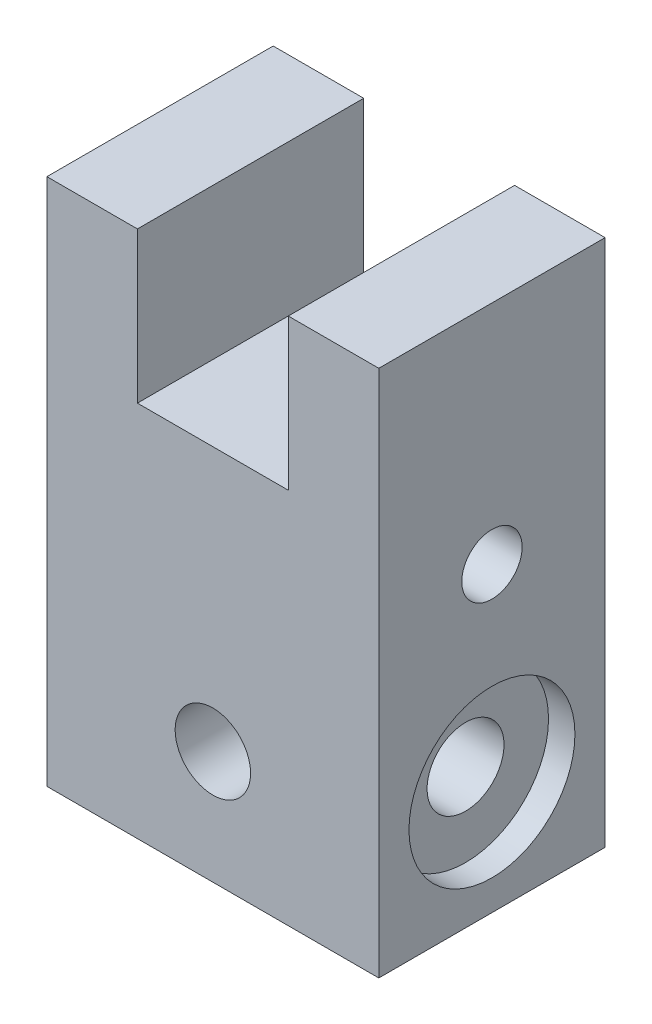
ISO-10303-21;
HEADER;
FILE_DESCRIPTION(('STEP AP214'),'2;1');
FILE_NAME('part.step','',(''),(''),'','','');
FILE_SCHEMA(('AUTOMOTIVE_DESIGN { 1 0 10303 214 1 1 1 1 }'));
ENDSEC;
DATA;
#1=APPLICATION_CONTEXT('core data for automotive mechanical design processes');
#2=APPLICATION_PROTOCOL_DEFINITION('international standard','automotive_design',2000,#1);
#3=PRODUCT_CONTEXT('',#1,'mechanical');
#4=PRODUCT('Part','Part','',(#3));
#5=PRODUCT_RELATED_PRODUCT_CATEGORY('part','',(#4));
#6=PRODUCT_DEFINITION_FORMATION('','',#4);
#7=PRODUCT_DEFINITION_CONTEXT('part definition',#1,'design');
#8=PRODUCT_DEFINITION('design','',#6,#7);
#9=PRODUCT_DEFINITION_SHAPE('','',#8);
#10=(LENGTH_UNIT() NAMED_UNIT(*) SI_UNIT(.MILLI.,.METRE.));
#11=(NAMED_UNIT(*) PLANE_ANGLE_UNIT() SI_UNIT($,.RADIAN.));
#12=(NAMED_UNIT(*) SI_UNIT($,.STERADIAN.) SOLID_ANGLE_UNIT());
#13=UNCERTAINTY_MEASURE_WITH_UNIT(LENGTH_MEASURE(1.E-05),#10,'distance_accuracy_value','');
#14=(GEOMETRIC_REPRESENTATION_CONTEXT(3) GLOBAL_UNCERTAINTY_ASSIGNED_CONTEXT((#13)) GLOBAL_UNIT_ASSIGNED_CONTEXT((#10,
#11,#12)) REPRESENTATION_CONTEXT('',''));
#15=CARTESIAN_POINT('',(0.,0.,0.));
#16=DIRECTION('',(0.,0.,1.));
#17=DIRECTION('',(1.,0.,0.));
#18=AXIS2_PLACEMENT_3D('',#15,#16,#17);
#19=CARTESIAN_POINT('',(0.,-20.,30.));
#20=DIRECTION('',(0.,0.,-1.));
#21=DIRECTION('',(-1.,0.,0.));
#22=AXIS2_PLACEMENT_3D('',#19,#20,#21);
#23=CYLINDRICAL_SURFACE('',#22,4.99999999999999);
#24=CARTESIAN_POINT('',(-4.99999999999999,-20.,20.1));
#25=CARTESIAN_POINT('',(-4.99999938883946,-20.1123940697062,20.0999993905356));
#26=CARTESIAN_POINT('',(-4.99620273409828,-20.2247969901896,20.096277023235));
#27=CARTESIAN_POINT('',(-4.98109753685119,-20.4486117298508,20.0814693234126));
#28=CARTESIAN_POINT('',(-4.96978818330873,-20.5600234407061,20.0703831959331));
#29=CARTESIAN_POINT('',(-4.93989274839192,-20.7809552507566,20.0410843618527));
#30=CARTESIAN_POINT('',(-4.92130380175463,-20.8904745873651,20.0228688491126));
#31=CARTESIAN_POINT('',(-4.87721207133648,-21.1067952217024,19.979676492711));
#32=CARTESIAN_POINT('',(-4.85170611820114,-21.2135952488514,19.9546965496127));
#33=CARTESIAN_POINT('',(-4.79445298905873,-21.4229963149376,19.8986473254707));
#34=CARTESIAN_POINT('',(-4.76275122719556,-21.525621707947,19.8676223581193));
#35=CARTESIAN_POINT('',(-4.69349933438181,-21.7269657735753,19.7998837672135));
#36=CARTESIAN_POINT('',(-4.65594701278198,-21.8256829653957,19.763168012861));
#37=CARTESIAN_POINT('',(-4.53533692645986,-22.1152791120684,19.6453189604361));
#38=CARTESIAN_POINT('',(-4.44428734893339,-22.2997403074146,19.5564459465569));
#39=CARTESIAN_POINT('',(-4.20417392701182,-22.7213108193189,19.322505945113));
#40=CARTESIAN_POINT('',(-4.04661791593068,-22.9490677290808,19.1693272044591));
#41=CARTESIAN_POINT('',(-3.79183142873294,-23.2619355683763,18.9226950310225));
#42=CARTESIAN_POINT('',(-3.70365902606225,-23.361577191205,18.8375120053331));
#43=CARTESIAN_POINT('',(-3.52196435648985,-23.5514805066895,18.6624635457724));
#44=CARTESIAN_POINT('',(-3.42844219090556,-23.6417423768945,18.5725982005809));
#45=CARTESIAN_POINT('',(-3.20102549888611,-23.8450776978563,18.3548638020938));
#46=CARTESIAN_POINT('',(-3.06509252427805,-23.9540885044516,18.225330930573));
#47=CARTESIAN_POINT('',(-2.7858950196035,-24.1555320041199,17.9612719504092));
#48=CARTESIAN_POINT('',(-2.64262651147801,-24.247955576889,17.8267431435693));
#49=CARTESIAN_POINT('',(-2.34977259493208,-24.4166823975563,17.5550826453986));
#50=CARTESIAN_POINT('',(-2.20019749447537,-24.4930108137673,17.4179553888693));
#51=CARTESIAN_POINT('',(-1.89449621717813,-24.6302278283802,17.1434607087125));
#52=CARTESIAN_POINT('',(-1.7383744748575,-24.6911266875649,17.0060935061829));
#53=CARTESIAN_POINT('',(-1.47348472846964,-24.7792197276087,16.7827143448104));
#54=CARTESIAN_POINT('',(-1.3671696822727,-24.8107644817282,16.6954845942701));
#55=CARTESIAN_POINT('',(-1.14930451610944,-24.8674253133798,16.5251740585487));
#56=CARTESIAN_POINT('',(-1.03774971650812,-24.8925355098598,16.4420971243716));
#57=CARTESIAN_POINT('',(-0.837235231619031,-24.9301628542857,16.3065470074317));
#58=CARTESIAN_POINT('',(-0.750126875584518,-24.944253696249,16.2517997832231));
#59=CARTESIAN_POINT('',(-0.569550437915913,-24.9682864399453,16.152685260939));
#60=CARTESIAN_POINT('',(-0.476104062839283,-24.978241745637,16.1082846365546));
#61=CARTESIAN_POINT('',(-0.321076492559271,-24.9900135723507,16.0536713300062));
#62=CARTESIAN_POINT('',(-0.262027114375922,-24.9934935071223,16.0369000410613));
#63=CARTESIAN_POINT('',(-0.141977093931662,-24.998342197072,16.0132753699319));
#64=CARTESIAN_POINT('',(-0.0809837632249051,-24.9997180852815,16.0063884830536));
#65=CARTESIAN_POINT('',(0.0415519827330485,-25.0002041737693,16.0039733849535));
#66=CARTESIAN_POINT('',(0.103095624630971,-24.9993032668446,16.0085008577131));
#67=CARTESIAN_POINT('',(0.224491766708706,-24.9953296237986,16.0279944983225));
#68=CARTESIAN_POINT('',(0.284339108966336,-24.9922508772992,16.0429895529805));
#69=CARTESIAN_POINT('',(0.438476094120602,-24.9816626149627,16.0926998390741));
#70=CARTESIAN_POINT('',(0.530474672282725,-24.9725806145029,16.1338914815036));
#71=CARTESIAN_POINT('',(0.708353745057084,-24.950387928059,16.2271878426125));
#72=CARTESIAN_POINT('',(0.79419851413191,-24.937255749126,16.2793502984208));
#73=CARTESIAN_POINT('',(0.954171628588626,-24.9087211796285,16.3846240945548));
#74=CARTESIAN_POINT('',(1.02867037475391,-24.8936145122802,16.4372606655345));
#75=CARTESIAN_POINT('',(1.17496141265023,-24.860564435316,16.5453544739763));
#76=CARTESIAN_POINT('',(1.24675232806403,-24.8426196065753,16.6008131130568));
#77=CARTESIAN_POINT('',(1.45931524834285,-24.7845643487627,16.7697704229221));
#78=CARTESIAN_POINT('',(1.5970377550248,-24.7402772884243,16.8856805589752));
#79=CARTESIAN_POINT('',(1.86712145824969,-24.6405329512191,17.1193662105984));
#80=CARTESIAN_POINT('',(1.99947253956822,-24.5850556764047,17.2371447129109));
#81=CARTESIAN_POINT('',(2.25921821236794,-24.462792305436,17.4720427882356));
#82=CARTESIAN_POINT('',(2.38661740669005,-24.396017035781,17.5891628821945));
#83=CARTESIAN_POINT('',(2.63636439200517,-24.2509277412028,17.8210446969145));
#84=CARTESIAN_POINT('',(2.75872188652085,-24.1726373478705,17.9358107118061));
#85=CARTESIAN_POINT('',(2.99825995240174,-24.0039854348032,18.161962644206));
#86=CARTESIAN_POINT('',(3.115438738311,-23.9136197944455,18.2733473918789));
#87=CARTESIAN_POINT('',(3.34353766187315,-23.7206204437742,18.4911463889659));
#88=CARTESIAN_POINT('',(3.45447156547252,-23.618015407946,18.597571474232));
#89=CARTESIAN_POINT('',(3.66920843635936,-23.4000458080326,18.8042402475719));
#90=CARTESIAN_POINT('',(3.77301445570251,-23.2846867609567,18.9044865793911));
#91=CARTESIAN_POINT('',(4.01531700878147,-22.9879941992651,19.1390193004885));
#92=CARTESIAN_POINT('',(4.14939291064509,-22.7997094791452,19.2692698930109));
#93=CARTESIAN_POINT('',(4.39467267725079,-22.3963412728561,19.5080336083476));
#94=CARTESIAN_POINT('',(4.50590079119612,-22.1812865921795,19.6165697742674));
#95=CARTESIAN_POINT('',(4.68284937407106,-21.7644212614809,19.7894451797793));
#96=CARTESIAN_POINT('',(4.75306495770468,-21.5663782416278,19.8581358486135));
#97=CARTESIAN_POINT('',(4.83999623805848,-21.2592881282573,19.9432306811152));
#98=CARTESIAN_POINT('',(4.86591198497462,-21.1552276997866,19.9686093582196));
#99=CARTESIAN_POINT('',(4.91118850676015,-20.9443689261955,20.0129583556086));
#100=CARTESIAN_POINT('',(4.93055207073866,-20.8375717669152,20.0319314026105));
#101=CARTESIAN_POINT('',(4.96245390011843,-20.6213433458562,20.0631945074366));
#102=CARTESIAN_POINT('',(4.97495160640553,-20.5119003356409,20.0754448513639));
#103=CARTESIAN_POINT('',(4.99269062328222,-20.2919083389087,20.0928338436306));
#104=CARTESIAN_POINT('',(4.9979350187314,-20.1813598427209,20.097975515314));
#105=CARTESIAN_POINT('',(5.0010650581874,-19.9600525404489,20.1010441698409));
#106=CARTESIAN_POINT('',(4.99895031247216,-19.849293723537,20.0989707705919));
#107=CARTESIAN_POINT('',(4.98740715914405,-19.6285334611735,20.087654556321));
#108=CARTESIAN_POINT('',(4.97797910299165,-19.5185319795823,20.0784120858277));
#109=CARTESIAN_POINT('',(4.95313657018676,-19.3097029676978,20.0540633503142));
#110=CARTESIAN_POINT('',(4.93831468605928,-19.2107363365119,20.0395375962731));
#111=CARTESIAN_POINT('',(4.90299114589694,-19.0148061314699,20.0049285656618));
#112=CARTESIAN_POINT('',(4.88248781162426,-18.9178431585805,19.9848436469776));
#113=CARTESIAN_POINT('',(4.81289199003775,-18.6307919206377,19.9166898394164));
#114=CARTESIAN_POINT('',(4.75569857833229,-18.4444186113975,19.8607070751489));
#115=CARTESIAN_POINT('',(4.64574506258124,-18.1471934532557,19.7531952644125));
#116=CARTESIAN_POINT('',(4.59822973735862,-18.0324196067918,19.7067606685834));
#117=CARTESIAN_POINT('',(4.49611957002097,-17.8091178569083,19.6070564503149));
#118=CARTESIAN_POINT('',(4.44152288740802,-17.7005915879059,19.5537850509769));
#119=CARTESIAN_POINT('',(4.2682854183295,-17.3847688708593,19.3849282639809));
#120=CARTESIAN_POINT('',(4.14025118008304,-17.1873698531876,19.2603531562302));
#121=CARTESIAN_POINT('',(3.81616986427527,-16.7544016988713,18.9460137910313));
#122=CARTESIAN_POINT('',(3.61213715774935,-16.5302633069813,18.748830747909));
#123=CARTESIAN_POINT('',(3.28788033526121,-16.2301717520683,18.4379113884683));
#124=CARTESIAN_POINT('',(3.17658438451818,-16.1360497660751,18.3315812447131));
#125=CARTESIAN_POINT('',(2.94866328717599,-15.9594362722775,18.1150193359204));
#126=CARTESIAN_POINT('',(2.83203918171972,-15.8769425050342,18.0047883340671));
#127=CARTESIAN_POINT('',(2.59026962582338,-15.7207608620611,17.7780682371806));
#128=CARTESIAN_POINT('',(2.46497089280561,-15.6474395505771,17.6614917768472));
#129=CARTESIAN_POINT('',(2.20953638916673,-15.5123691803153,17.4268299826125));
#130=CARTESIAN_POINT('',(2.07939842549348,-15.4506254468001,17.3087439809214));
#131=CARTESIAN_POINT('',(1.81432466377661,-15.3385700061652,17.0731597073836));
#132=CARTESIAN_POINT('',(1.6794004534695,-15.2882326125725,16.9556607096287));
#133=CARTESIAN_POINT('',(1.47217645545821,-15.2210938418232,16.7821105415002));
#134=CARTESIAN_POINT('',(1.40232215954265,-15.2001150005986,16.7247308697154));
#135=CARTESIAN_POINT('',(1.26056558325097,-15.1609520251802,16.611580138564));
#136=CARTESIAN_POINT('',(1.18866375360582,-15.1427672814632,16.5558087305227));
#137=CARTESIAN_POINT('',(1.0308945320721,-15.1066584063721,16.438581882256));
#138=CARTESIAN_POINT('',(0.944582629335364,-15.0892063675016,16.3775751267407));
#139=CARTESIAN_POINT('',(0.766754131203087,-15.058315443,16.2622494075815));
#140=CARTESIAN_POINT('',(0.675240392162123,-15.0448743797859,16.207926824509));
#141=CARTESIAN_POINT('',(0.517407414570502,-15.0264455046954,16.1290735515903));
#142=CARTESIAN_POINT('',(0.453210107545415,-15.0201394970412,16.1007146725092));
#143=CARTESIAN_POINT('',(0.321299583514299,-15.009898872766,16.0533199277481));
#144=CARTESIAN_POINT('',(0.253598092567582,-15.0059568405411,16.0342549434418));
#145=CARTESIAN_POINT('',(0.127575882896808,-15.0013030905297,16.0115082104024));
#146=CARTESIAN_POINT('',(0.0696679466529424,-15.0001492635833,16.0057298927046));
#147=CARTESIAN_POINT('',(-0.0462215085406665,-14.9998782230557,16.0043819775927));
#148=CARTESIAN_POINT('',(-0.104202900730942,-15.0007590252266,16.008802433941));
#149=CARTESIAN_POINT('',(-0.23430981026927,-15.004959620603,16.0294180510585));
#150=CARTESIAN_POINT('',(-0.305934928922705,-15.0088840967342,16.0485196883654));
#151=CARTESIAN_POINT('',(-0.445437451004786,-15.0193838549233,16.0973041252139));
#152=CARTESIAN_POINT('',(-0.513292103096337,-15.0259735817387,16.1270444798487));
#153=CARTESIAN_POINT('',(-0.677722921199077,-15.0451515193746,16.2091269188347));
#154=CARTESIAN_POINT('',(-0.772110096247877,-15.0590971476556,16.2654082682225));
#155=CARTESIAN_POINT('',(-0.955597315168207,-15.0912821974565,16.3850583393978));
#156=CARTESIAN_POINT('',(-1.04468280791503,-15.1095328101592,16.4484453035834));
#157=CARTESIAN_POINT('',(-1.2196473490044,-15.1501997871947,16.5792916602226));
#158=CARTESIAN_POINT('',(-1.30550445082032,-15.1726400268042,16.6467728168068));
#159=CARTESIAN_POINT('',(-1.47434395789639,-15.2215053577082,16.7836144950955));
#160=CARTESIAN_POINT('',(-1.55732943230454,-15.2479260221852,16.8529728596379));
#161=CARTESIAN_POINT('',(-1.80939407509645,-15.3353881051664,17.0678113281786));
#162=CARTESIAN_POINT('',(-1.97492452222866,-15.4030665235455,17.2148124017508));
#163=CARTESIAN_POINT('',(-2.29871780234092,-15.5561380944276,17.5079007076153));
#164=CARTESIAN_POINT('',(-2.45697329283375,-15.6415486841882,17.6539868934585));
#165=CARTESIAN_POINT('',(-2.76528790163346,-15.8303806906747,17.9417268223543));
#166=CARTESIAN_POINT('',(-2.9153774387456,-15.9337282510637,18.0833960356533));
#167=CARTESIAN_POINT('',(-3.20677925659712,-16.159363538154,18.3602677157739));
#168=CARTESIAN_POINT('',(-3.34809869104244,-16.2816355361104,18.4954754319242));
#169=CARTESIAN_POINT('',(-3.65577428699677,-16.5805626717426,18.791096914425));
#170=CARTESIAN_POINT('',(-3.8190529655827,-16.7630853680067,18.9488927101653));
#171=CARTESIAN_POINT('',(-4.12321763802115,-17.1607038166318,19.243766339593));
#172=CARTESIAN_POINT('',(-4.2641277829106,-17.3757639417594,19.3808665101372));
#173=CARTESIAN_POINT('',(-4.49176480766176,-17.7934007719016,19.6027643812051));
#174=CARTESIAN_POINT('',(-4.58370036445148,-17.9904111787305,19.6925498887749));
#175=CARTESIAN_POINT('',(-4.70325565682088,-18.2995228356619,19.8094224851455));
#176=CARTESIAN_POINT('',(-4.74004601807609,-18.4048122826964,19.8454090761987));
#177=CARTESIAN_POINT('',(-4.80695094370819,-18.6194778829025,19.9108786905929));
#178=CARTESIAN_POINT('',(-4.83706665514042,-18.7288533301037,19.940362831392));
#179=CARTESIAN_POINT('',(-4.88582600582943,-18.933265790087,19.9881134317611));
#180=CARTESIAN_POINT('',(-4.90553314999992,-19.0278087777144,20.0074188921567));
#181=CARTESIAN_POINT('',(-4.93954358341147,-19.2187762358926,20.0407419289476));
#182=CARTESIAN_POINT('',(-4.95384763626243,-19.3152004385471,20.0547602525646));
#183=CARTESIAN_POINT('',(-4.97682979090269,-19.509365242297,20.0772856495319));
#184=CARTESIAN_POINT('',(-4.98550749698689,-19.6071059354887,20.0857923352446));
#185=CARTESIAN_POINT('',(-4.99709211644436,-19.8032289410168,20.0971490395287));
#186=CARTESIAN_POINT('',(-5.0000005350053,-19.9016110792802,20.1000005335206));
#187=CARTESIAN_POINT('',(-4.99999999999999,-20.,20.1));
#188=B_SPLINE_CURVE_WITH_KNOTS('',3,(#24,#25,#26,#27,#28,#29,#30,#31,#32,#33,#34,#35,#36,#37,
#38,#39,#40,#41,#42,#43,#44,#45,#46,#47,#48,#49,#50,#51,#52,#53,#54,#55,#56,#57,#58,#59,#60,#61,
#62,#63,#64,#65,#66,#67,#68,#69,#70,#71,#72,#73,#74,#75,#76,#77,#78,#79,#80,#81,#82,#83,#84,#85,
#86,#87,#88,#89,#90,#91,#92,#93,#94,#95,#96,#97,#98,#99,#100,#101,#102,#103,#104,#105,#106,#107,
#108,#109,#110,#111,#112,#113,#114,#115,#116,#117,#118,#119,#120,#121,#122,#123,#124,#125,#126,
#127,#128,#129,#130,#131,#132,#133,#134,#135,#136,#137,#138,#139,#140,#141,#142,#143,#144,#145,
#146,#147,#148,#149,#150,#151,#152,#153,#154,#155,#156,#157,#158,#159,#160,#161,#162,#163,#164,
#165,#166,#167,#168,#169,#170,#171,#172,#173,#174,#175,#176,#177,#178,#179,#180,#181,#182,#183,
#184,#185,#186,#187),.UNSPECIFIED.,.T.,.F.,(4,2,2,2,2,2,2,2,2,2,2,2,2,2,2,2,2,2,2,2,2,2,2,2,2,2,
2,2,2,2,2,2,2,2,2,2,2,2,2,2,2,2,2,2,2,2,2,2,2,2,2,2,2,2,2,2,2,2,2,2,2,2,2,2,2,2,2,2,2,2,2,2,2,2,
2,2,2,2,2,2,2,4),(0.,0.337073234581563,0.674182863960078,1.01142531396549,1.34882254943247,
1.68383368191582,2.01897055681925,2.68880549574337,3.63279806025707,4.10643159594765,
4.58005616461381,5.23048430359105,5.8812689847548,6.53102834828947,7.18035447559783,
7.60344963531998,8.02693012696502,8.33812920367037,8.64831161090039,8.83209802624871,
9.01525998607135,9.1993172131728,9.3838843912326,9.68578472243752,9.98931553650319,
10.2665180337727,10.5438595773719,11.0994309508408,11.6560041212273,12.2120469355288,
12.7669641496501,13.3220712126332,13.8759024094902,14.4294949657695,15.2225837474366,
16.0148263952475,16.6750119629206,17.0052629904454,17.3353732605574,17.6674131987194,
17.9993118756116,18.3312281293111,18.663128432886,18.966135439385,19.2692320464061,
19.8750558067868,20.2724450148882,20.6699377151733,21.4653975763528,22.5440547076217,
23.0849637376934,23.6257675202904,24.1838886213989,24.7422658114395,25.2993727847416,
25.5777210565778,25.8560085211854,26.1771849466211,26.4981866848757,26.7091092131385,
26.9193665852082,27.0931088819884,27.2666818102157,27.4880380127104,27.7106103195533,
28.0420697744171,28.3744005723748,28.7086864562485,29.0426032726942,29.7362002845327,
30.4304826161462,31.1219712391351,31.8128881984081,32.6839251407553,33.5540151428795,
34.2566123890258,34.6078246660004,34.9589765393823,35.2541458965284,35.5492735222592,
35.8444219022812,36.1394932689529),.UNSPECIFIED.);
#189=CARTESIAN_POINT('',(-4.99999999999999,-20.,20.1));
#190=VERTEX_POINT('',#189);
#191=EDGE_CURVE('E46',#190,#190,#188,.T.);
#192=ORIENTED_EDGE('',*,*,#191,.F.);
#193=EDGE_LOOP('',(#192));
#194=FACE_BOUND('',#193,.T.);
#195=CARTESIAN_POINT('',(0.,-20.,30.));
#196=DIRECTION('',(0.,0.,1.));
#197=DIRECTION('',(1.,0.,0.));
#198=AXIS2_PLACEMENT_3D('',#195,#196,#197);
#199=CIRCLE('',#198,4.99999999999999);
#200=CARTESIAN_POINT('',(5.,-20.,30.));
#201=VERTEX_POINT('',#200);
#202=EDGE_CURVE('E262',#201,#201,#199,.T.);
#203=ORIENTED_EDGE('',*,*,#202,.T.);
#204=EDGE_LOOP('',(#203));
#205=FACE_BOUND('',#204,.T.);
#206=ADVANCED_FACE('F41',(#194,#205),#23,.F.);
#207=CARTESIAN_POINT('',(10.,0.,30.));
#208=DIRECTION('',(-1.,0.,0.));
#209=DIRECTION('',(0.,-1.,0.));
#210=AXIS2_PLACEMENT_3D('',#207,#208,#209);
#211=PLANE('',#210);
#212=DIRECTION('',(0.,1.,0.));
#213=VECTOR('',#212,1.);
#214=CARTESIAN_POINT('',(10.,0.,0.));
#215=LINE('',#214,#213);
#216=CARTESIAN_POINT('',(10.,15.,0.));
#217=VERTEX_POINT('',#216);
#218=CARTESIAN_POINT('',(10.,35.,0.));
#219=VERTEX_POINT('',#218);
#220=EDGE_CURVE('E152',#217,#219,#215,.T.);
#221=ORIENTED_EDGE('',*,*,#220,.F.);
#222=DIRECTION('',(0.,0.,-1.));
#223=VECTOR('',#222,1.);
#224=CARTESIAN_POINT('',(10.,15.,30.));
#225=LINE('',#224,#223);
#226=CARTESIAN_POINT('',(10.,15.,30.));
#227=VERTEX_POINT('',#226);
#228=EDGE_CURVE('E11',#227,#217,#225,.T.);
#229=ORIENTED_EDGE('',*,*,#228,.F.);
#230=DIRECTION('',(0.,1.,0.));
#231=VECTOR('',#230,1.);
#232=CARTESIAN_POINT('',(10.,0.,30.));
#233=LINE('',#232,#231);
#234=CARTESIAN_POINT('',(10.,35.,30.));
#235=VERTEX_POINT('',#234);
#236=EDGE_CURVE('E257',#227,#235,#233,.T.);
#237=ORIENTED_EDGE('',*,*,#236,.T.);
#238=DIRECTION('',(0.,0.,-1.));
#239=VECTOR('',#238,1.);
#240=CARTESIAN_POINT('',(10.,35.,30.));
#241=LINE('',#240,#239);
#242=EDGE_CURVE('E66',#235,#219,#241,.T.);
#243=ORIENTED_EDGE('',*,*,#242,.T.);
#244=EDGE_LOOP('',(#221,#229,#237,#243));
#245=FACE_BOUND('',#244,.T.);
#246=ADVANCED_FACE('F240',(#245),#211,.T.);
#247=CARTESIAN_POINT('',(0.,15.,30.));
#248=DIRECTION('',(0.,1.,0.));
#249=DIRECTION('',(0.,0.,1.));
#250=AXIS2_PLACEMENT_3D('',#247,#248,#249);
#251=PLANE('',#250);
#252=DIRECTION('',(1.,0.,0.));
#253=VECTOR('',#252,1.);
#254=CARTESIAN_POINT('',(0.,15.,0.));
#255=LINE('',#254,#253);
#256=CARTESIAN_POINT('',(-9.99999999999999,15.,0.));
#257=VERTEX_POINT('',#256);
#258=EDGE_CURVE('E156',#257,#217,#255,.T.);
#259=ORIENTED_EDGE('',*,*,#258,.F.);
#260=DIRECTION('',(0.,0.,-1.));
#261=VECTOR('',#260,1.);
#262=CARTESIAN_POINT('',(-9.99999999999999,15.,30.));
#263=LINE('',#262,#261);
#264=CARTESIAN_POINT('',(-9.99999999999999,15.,30.));
#265=VERTEX_POINT('',#264);
#266=EDGE_CURVE('E57',#265,#257,#263,.T.);
#267=ORIENTED_EDGE('',*,*,#266,.F.);
#268=DIRECTION('',(1.,0.,0.));
#269=VECTOR('',#268,1.);
#270=CARTESIAN_POINT('',(0.,15.,30.));
#271=LINE('',#270,#269);
#272=EDGE_CURVE('E254',#265,#227,#271,.T.);
#273=ORIENTED_EDGE('',*,*,#272,.T.);
#274=ORIENTED_EDGE('',*,*,#228,.T.);
#275=EDGE_LOOP('',(#259,#267,#273,#274));
#276=FACE_BOUND('',#275,.T.);
#277=ADVANCED_FACE('F237',(#276),#251,.T.);
#278=CARTESIAN_POINT('',(-9.99999999999999,0.,30.));
#279=DIRECTION('',(-1.,0.,0.));
#280=DIRECTION('',(0.,0.,1.));
#281=AXIS2_PLACEMENT_3D('',#278,#279,#280);
#282=PLANE('',#281);
#283=DIRECTION('',(0.,1.,0.));
#284=VECTOR('',#283,1.);
#285=CARTESIAN_POINT('',(-9.99999999999999,0.,0.));
#286=LINE('',#285,#284);
#287=CARTESIAN_POINT('',(-9.99999999999999,35.,0.));
#288=VERTEX_POINT('',#287);
#289=EDGE_CURVE('E160',#257,#288,#286,.T.);
#290=ORIENTED_EDGE('',*,*,#289,.T.);
#291=DIRECTION('',(0.,0.,-1.));
#292=VECTOR('',#291,1.);
#293=CARTESIAN_POINT('',(-9.99999999999999,35.,30.));
#294=LINE('',#293,#292);
#295=CARTESIAN_POINT('',(-9.99999999999999,35.,30.));
#296=VERTEX_POINT('',#295);
#297=EDGE_CURVE('E187',#296,#288,#294,.T.);
#298=ORIENTED_EDGE('',*,*,#297,.F.);
#299=DIRECTION('',(0.,1.,0.));
#300=VECTOR('',#299,1.);
#301=CARTESIAN_POINT('',(-9.99999999999999,0.,30.));
#302=LINE('',#301,#300);
#303=EDGE_CURVE('E256',#265,#296,#302,.T.);
#304=ORIENTED_EDGE('',*,*,#303,.F.);
#305=ORIENTED_EDGE('',*,*,#266,.T.);
#306=EDGE_LOOP('',(#290,#298,#304,#305));
#307=FACE_BOUND('',#306,.T.);
#308=ADVANCED_FACE('F234',(#307),#282,.F.);
#309=CARTESIAN_POINT('',(0.,35.,30.));
#310=DIRECTION('',(0.,1.,0.));
#311=DIRECTION('',(0.,0.,1.));
#312=AXIS2_PLACEMENT_3D('',#309,#310,#311);
#313=PLANE('',#312);
#314=DIRECTION('',(1.,0.,0.));
#315=VECTOR('',#314,1.);
#316=CARTESIAN_POINT('',(0.,35.,0.));
#317=LINE('',#316,#315);
#318=CARTESIAN_POINT('',(-22.,35.,0.));
#319=VERTEX_POINT('',#318);
#320=EDGE_CURVE('E164',#319,#288,#317,.T.);
#321=ORIENTED_EDGE('',*,*,#320,.F.);
#322=DIRECTION('',(0.,0.,-1.));
#323=VECTOR('',#322,1.);
#324=CARTESIAN_POINT('',(-22.,35.,30.));
#325=LINE('',#324,#323);
#326=CARTESIAN_POINT('',(-22.,35.,30.));
#327=VERTEX_POINT('',#326);
#328=EDGE_CURVE('E184',#327,#319,#325,.T.);
#329=ORIENTED_EDGE('',*,*,#328,.F.);
#330=DIRECTION('',(1.,0.,0.));
#331=VECTOR('',#330,1.);
#332=CARTESIAN_POINT('',(0.,35.,30.));
#333=LINE('',#332,#331);
#334=EDGE_CURVE('E145',#327,#296,#333,.T.);
#335=ORIENTED_EDGE('',*,*,#334,.T.);
#336=ORIENTED_EDGE('',*,*,#297,.T.);
#337=EDGE_LOOP('',(#321,#329,#335,#336));
#338=FACE_BOUND('',#337,.T.);
#339=ADVANCED_FACE('F224',(#338),#313,.T.);
#340=CARTESIAN_POINT('',(-22.,0.,30.));
#341=DIRECTION('',(1.,0.,0.));
#342=DIRECTION('',(0.,1.,0.));
#343=AXIS2_PLACEMENT_3D('',#340,#341,#342);
#344=PLANE('',#343);
#345=CARTESIAN_POINT('',(-22.,4.99999999999999,15.));
#346=DIRECTION('',(1.,0.,0.));
#347=DIRECTION('',(0.,1.,0.));
#348=AXIS2_PLACEMENT_3D('',#345,#346,#347);
#349=CIRCLE('',#348,4.);
#350=CARTESIAN_POINT('',(-22.,8.99999999999999,15.));
#351=VERTEX_POINT('',#350);
#352=EDGE_CURVE('E290',#351,#351,#349,.T.);
#353=ORIENTED_EDGE('',*,*,#352,.T.);
#354=EDGE_LOOP('',(#353));
#355=FACE_BOUND('',#354,.T.);
#356=CARTESIAN_POINT('',(-22.,-20.,15.));
#357=DIRECTION('',(1.,0.,0.));
#358=DIRECTION('',(0.,1.,0.));
#359=AXIS2_PLACEMENT_3D('',#356,#357,#358);
#360=CIRCLE('',#359,5.1);
#361=CARTESIAN_POINT('',(-22.,-14.9,15.));
#362=VERTEX_POINT('',#361);
#363=EDGE_CURVE('E197',#362,#362,#360,.T.);
#364=ORIENTED_EDGE('',*,*,#363,.T.);
#365=EDGE_LOOP('',(#364));
#366=FACE_BOUND('',#365,.T.);
#367=DIRECTION('',(0.,-1.,0.));
#368=VECTOR('',#367,1.);
#369=CARTESIAN_POINT('',(-22.,0.,0.));
#370=LINE('',#369,#368);
#371=CARTESIAN_POINT('',(-22.,-35.,0.));
#372=VERTEX_POINT('',#371);
#373=EDGE_CURVE('E168',#319,#372,#370,.T.);
#374=ORIENTED_EDGE('',*,*,#373,.T.);
#375=DIRECTION('',(0.,0.,-1.));
#376=VECTOR('',#375,1.);
#377=CARTESIAN_POINT('',(-22.,-35.,30.));
#378=LINE('',#377,#376);
#379=CARTESIAN_POINT('',(-22.,-35.,30.));
#380=VERTEX_POINT('',#379);
#381=EDGE_CURVE('E137',#380,#372,#378,.T.);
#382=ORIENTED_EDGE('',*,*,#381,.F.);
#383=DIRECTION('',(0.,-1.,0.));
#384=VECTOR('',#383,1.);
#385=CARTESIAN_POINT('',(-22.,0.,30.));
#386=LINE('',#385,#384);
#387=EDGE_CURVE('E124',#327,#380,#386,.T.);
#388=ORIENTED_EDGE('',*,*,#387,.F.);
#389=ORIENTED_EDGE('',*,*,#328,.T.);
#390=EDGE_LOOP('',(#374,#382,#388,#389));
#391=FACE_BOUND('',#390,.T.);
#392=ADVANCED_FACE('F230',(#355,#366,#391),#344,.F.);
#393=CARTESIAN_POINT('',(0.,-35.,30.));
#394=DIRECTION('',(0.,1.,0.));
#395=DIRECTION('',(0.,0.,1.));
#396=AXIS2_PLACEMENT_3D('',#393,#394,#395);
#397=PLANE('',#396);
#398=DIRECTION('',(1.,0.,0.));
#399=VECTOR('',#398,1.);
#400=CARTESIAN_POINT('',(0.,-35.,0.));
#401=LINE('',#400,#399);
#402=CARTESIAN_POINT('',(22.,-35.,0.));
#403=VERTEX_POINT('',#402);
#404=EDGE_CURVE('E133',#372,#403,#401,.T.);
#405=ORIENTED_EDGE('',*,*,#404,.T.);
#406=DIRECTION('',(0.,0.,-1.));
#407=VECTOR('',#406,1.);
#408=CARTESIAN_POINT('',(22.,-35.,30.));
#409=LINE('',#408,#407);
#410=CARTESIAN_POINT('',(22.,-35.,30.));
#411=VERTEX_POINT('',#410);
#412=EDGE_CURVE('E131',#411,#403,#409,.T.);
#413=ORIENTED_EDGE('',*,*,#412,.F.);
#414=DIRECTION('',(1.,0.,0.));
#415=VECTOR('',#414,1.);
#416=CARTESIAN_POINT('',(0.,-35.,30.));
#417=LINE('',#416,#415);
#418=EDGE_CURVE('E116',#380,#411,#417,.T.);
#419=ORIENTED_EDGE('',*,*,#418,.F.);
#420=ORIENTED_EDGE('',*,*,#381,.T.);
#421=EDGE_LOOP('',(#405,#413,#419,#420));
#422=FACE_BOUND('',#421,.T.);
#423=ADVANCED_FACE('F132',(#422),#397,.F.);
#424=CARTESIAN_POINT('',(22.,0.,30.));
#425=DIRECTION('',(1.,0.,0.));
#426=DIRECTION('',(0.,1.,0.));
#427=AXIS2_PLACEMENT_3D('',#424,#425,#426);
#428=PLANE('',#427);
#429=CARTESIAN_POINT('',(22.,5.,15.));
#430=DIRECTION('',(1.,0.,0.));
#431=DIRECTION('',(0.,1.,0.));
#432=AXIS2_PLACEMENT_3D('',#429,#430,#431);
#433=CIRCLE('',#432,4.);
#434=CARTESIAN_POINT('',(22.,9.,15.));
#435=VERTEX_POINT('',#434);
#436=EDGE_CURVE('E294',#435,#435,#433,.T.);
#437=ORIENTED_EDGE('',*,*,#436,.F.);
#438=EDGE_LOOP('',(#437));
#439=FACE_BOUND('',#438,.T.);
#440=CARTESIAN_POINT('',(22.,-20.,15.));
#441=DIRECTION('',(1.,0.,0.));
#442=DIRECTION('',(0.,1.,0.));
#443=AXIS2_PLACEMENT_3D('',#440,#441,#442);
#444=CIRCLE('',#443,11.);
#445=CARTESIAN_POINT('',(22.,-9.,15.));
#446=VERTEX_POINT('',#445);
#447=EDGE_CURVE('E279',#446,#446,#444,.T.);
#448=ORIENTED_EDGE('',*,*,#447,.F.);
#449=EDGE_LOOP('',(#448));
#450=FACE_BOUND('',#449,.T.);
#451=DIRECTION('',(0.,-1.,0.));
#452=VECTOR('',#451,1.);
#453=CARTESIAN_POINT('',(22.,0.,0.));
#454=LINE('',#453,#452);
#455=CARTESIAN_POINT('',(22.,35.,0.));
#456=VERTEX_POINT('',#455);
#457=EDGE_CURVE('E175',#456,#403,#454,.T.);
#458=ORIENTED_EDGE('',*,*,#457,.F.);
#459=DIRECTION('',(0.,0.,-1.));
#460=VECTOR('',#459,1.);
#461=CARTESIAN_POINT('',(22.,35.,30.));
#462=LINE('',#461,#460);
#463=CARTESIAN_POINT('',(22.,35.,30.));
#464=VERTEX_POINT('',#463);
#465=EDGE_CURVE('E91',#464,#456,#462,.T.);
#466=ORIENTED_EDGE('',*,*,#465,.F.);
#467=DIRECTION('',(0.,-1.,0.));
#468=VECTOR('',#467,1.);
#469=CARTESIAN_POINT('',(22.,0.,30.));
#470=LINE('',#469,#468);
#471=EDGE_CURVE('E121',#464,#411,#470,.T.);
#472=ORIENTED_EDGE('',*,*,#471,.T.);
#473=ORIENTED_EDGE('',*,*,#412,.T.);
#474=EDGE_LOOP('',(#458,#466,#472,#473));
#475=FACE_BOUND('',#474,.T.);
#476=ADVANCED_FACE('F139',(#439,#450,#475),#428,.T.);
#477=CARTESIAN_POINT('',(-4.99999999999999,-20.,9.9));
#478=CARTESIAN_POINT('',(-4.99999938883946,-19.8876059302938,9.90000060946441));
#479=CARTESIAN_POINT('',(-4.99620273409828,-19.7752030098104,9.90372297676504));
#480=CARTESIAN_POINT('',(-4.98109753685119,-19.5513882701491,9.91853067658741));
#481=CARTESIAN_POINT('',(-4.96978818330873,-19.4399765592939,9.92961680406695));
#482=CARTESIAN_POINT('',(-4.93989274839192,-19.2190447492434,9.95891563814734));
#483=CARTESIAN_POINT('',(-4.92130380175463,-19.1095254126349,9.97713115088742));
#484=CARTESIAN_POINT('',(-4.87721207133648,-18.8932047782976,10.020323507289));
#485=CARTESIAN_POINT('',(-4.85170611820114,-18.7864047511486,10.0453034503873));
#486=CARTESIAN_POINT('',(-4.79445298905873,-18.5770036850623,10.1013526745293));
#487=CARTESIAN_POINT('',(-4.76275122719556,-18.4743782920529,10.1323776418807));
#488=CARTESIAN_POINT('',(-4.69349933438181,-18.2730342264247,10.2001162327865));
#489=CARTESIAN_POINT('',(-4.65594701278198,-18.1743170346043,10.236831987139));
#490=CARTESIAN_POINT('',(-4.53533692645986,-17.8847208879316,10.3546810395639));
#491=CARTESIAN_POINT('',(-4.44428734893339,-17.7002596925854,10.4435540534431));
#492=CARTESIAN_POINT('',(-4.20417392701182,-17.2786891806811,10.677494054887));
#493=CARTESIAN_POINT('',(-4.04661791593068,-17.0509322709192,10.8306727955409));
#494=CARTESIAN_POINT('',(-3.79183142873293,-16.7380644316237,11.0773049689775));
#495=CARTESIAN_POINT('',(-3.70365902606225,-16.638422808795,11.1624879946669));
#496=CARTESIAN_POINT('',(-3.52196435648985,-16.4485194933104,11.3375364542276));
#497=CARTESIAN_POINT('',(-3.42844219090556,-16.3582576231055,11.4274017994191));
#498=CARTESIAN_POINT('',(-3.20102549888612,-16.1549223021437,11.6451361979062));
#499=CARTESIAN_POINT('',(-3.06509252427805,-16.0459114955484,11.7746690694271));
#500=CARTESIAN_POINT('',(-2.78589501960349,-15.84446799588,12.0387280495908));
#501=CARTESIAN_POINT('',(-2.642626511478,-15.752044423111,12.1732568564307));
#502=CARTESIAN_POINT('',(-2.34977259493208,-15.5833176024437,12.4449173546014));
#503=CARTESIAN_POINT('',(-2.20019749447537,-15.5069891862327,12.5820446111307));
#504=CARTESIAN_POINT('',(-1.89449621717813,-15.3697721716198,12.8565392912875));
#505=CARTESIAN_POINT('',(-1.7383744748575,-15.3088733124351,12.9939064938171));
#506=CARTESIAN_POINT('',(-1.47348472846964,-15.2207802723913,13.2172856551896));
#507=CARTESIAN_POINT('',(-1.3671696822727,-15.1892355182717,13.3045154057299));
#508=CARTESIAN_POINT('',(-1.14930451610945,-15.1325746866202,13.4748259414513));
#509=CARTESIAN_POINT('',(-1.03774971650813,-15.1074644901402,13.5579028756284));
#510=CARTESIAN_POINT('',(-0.837235231619039,-15.0698371457143,13.6934529925683));
#511=CARTESIAN_POINT('',(-0.750126875584525,-15.055746303751,13.748200216777));
#512=CARTESIAN_POINT('',(-0.569550437915918,-15.0317135600547,13.8473147390611));
#513=CARTESIAN_POINT('',(-0.476104062839287,-15.021758254363,13.8917153634455));
#514=CARTESIAN_POINT('',(-0.321076492559276,-15.0099864276493,13.9463286699938));
#515=CARTESIAN_POINT('',(-0.26202711437593,-15.0065064928777,13.9630999589387));
#516=CARTESIAN_POINT('',(-0.141977093931674,-15.001657802928,13.9867246300681));
#517=CARTESIAN_POINT('',(-0.0809837632249188,-15.0002819147185,13.9936115169464));
#518=CARTESIAN_POINT('',(0.0415519827330311,-14.9997958262307,13.9960266150465));
#519=CARTESIAN_POINT('',(0.103095624630952,-15.0006967331554,13.9914991422869));
#520=CARTESIAN_POINT('',(0.224491766708684,-15.0046703762014,13.9720055016775));
#521=CARTESIAN_POINT('',(0.284339108966311,-15.0077491227008,13.9570104470196));
#522=CARTESIAN_POINT('',(0.43847609412057,-15.0183373850373,13.9073001609259));
#523=CARTESIAN_POINT('',(0.530474672282686,-15.0274193854971,13.8661085184964));
#524=CARTESIAN_POINT('',(0.708353745057037,-15.049612071941,13.7728121573875));
#525=CARTESIAN_POINT('',(0.794198514131859,-15.0627442508739,13.7206497015792));
#526=CARTESIAN_POINT('',(0.954171628588568,-15.0912788203714,13.6153759054453));
#527=CARTESIAN_POINT('',(1.02867037475385,-15.1063854877198,13.5627393344656));
#528=CARTESIAN_POINT('',(1.17496141265016,-15.139435564684,13.4546455260238));
#529=CARTESIAN_POINT('',(1.24675232806396,-15.1573803934246,13.3991868869433));
#530=CARTESIAN_POINT('',(1.45931524834277,-15.2154356512372,13.230229577078));
#531=CARTESIAN_POINT('',(1.59703775502473,-15.2597227115757,13.1143194410249));
#532=CARTESIAN_POINT('',(1.8671214582496,-15.3594670487808,12.8806337894017));
#533=CARTESIAN_POINT('',(1.99947253956813,-15.4149443235953,12.7628552870892));
#534=CARTESIAN_POINT('',(2.25921821236784,-15.5372076945639,12.5279572117645));
#535=CARTESIAN_POINT('',(2.38661740668995,-15.6039829642189,12.4108371178056));
#536=CARTESIAN_POINT('',(2.63636439200506,-15.7490722587971,12.1789553030856));
#537=CARTESIAN_POINT('',(2.75872188652074,-15.8273626521294,12.0641892881941));
#538=CARTESIAN_POINT('',(2.99825995240163,-15.9960145651966,11.8380373557941));
#539=CARTESIAN_POINT('',(3.11543873831088,-16.0863802055544,11.7266526081212));
#540=CARTESIAN_POINT('',(3.34353766187302,-16.2793795562257,11.5088536110343));
#541=CARTESIAN_POINT('',(3.4544715654724,-16.3819845920539,11.4024285257681));
#542=CARTESIAN_POINT('',(3.66920843635923,-16.5999541919673,11.1957597524282));
#543=CARTESIAN_POINT('',(3.77301445570238,-16.7153132390431,11.095513420609));
#544=CARTESIAN_POINT('',(4.01531700878135,-17.0120058007347,10.8609806995116));
#545=CARTESIAN_POINT('',(4.14939291064497,-17.2002905208546,10.7307301069893));
#546=CARTESIAN_POINT('',(4.3946726772507,-17.6036587271437,10.4919663916525));
#547=CARTESIAN_POINT('',(4.50590079119604,-17.8187134078203,10.3834302257327));
#548=CARTESIAN_POINT('',(4.68284937407099,-18.2355787385189,10.2105548202208));
#549=CARTESIAN_POINT('',(4.75306495770462,-18.433621758372,10.1418641513865));
#550=CARTESIAN_POINT('',(4.83999623805844,-18.7407118717425,10.0567693188848));
#551=CARTESIAN_POINT('',(4.86591198497457,-18.8447723002132,10.0313906417804));
#552=CARTESIAN_POINT('',(4.91118850676011,-19.0556310738044,9.98704164439142));
#553=CARTESIAN_POINT('',(4.93055207073863,-19.1624282330847,9.96806859738951));
#554=CARTESIAN_POINT('',(4.96245390011841,-19.3786566541436,9.93680549256343));
#555=CARTESIAN_POINT('',(4.97495160640551,-19.4880996643589,9.92455514863612));
#556=CARTESIAN_POINT('',(4.99269062328221,-19.7080916610911,9.90716615636938));
#557=CARTESIAN_POINT('',(4.99793501873139,-19.8186401572789,9.902024484686));
#558=CARTESIAN_POINT('',(5.0010650581874,-20.0399474595509,9.89895583015911));
#559=CARTESIAN_POINT('',(4.99895031247216,-20.1507062764628,9.90102922940805));
#560=CARTESIAN_POINT('',(4.98740715914406,-20.3714665388264,9.912345443679));
#561=CARTESIAN_POINT('',(4.97797910299166,-20.4814680204175,9.92158791417234));
#562=CARTESIAN_POINT('',(4.95313657018677,-20.6902970323021,9.94593664968577));
#563=CARTESIAN_POINT('',(4.9383146860593,-20.789263663488,9.96046240372692));
#564=CARTESIAN_POINT('',(4.90299114589697,-20.98519386853,9.99507143433818));
#565=CARTESIAN_POINT('',(4.88248781162429,-21.0821568414193,10.0151563530223));
#566=CARTESIAN_POINT('',(4.81289199003779,-21.3692080793622,10.0833101605835));
#567=CARTESIAN_POINT('',(4.75569857833234,-21.5555813886023,10.139292924851));
#568=CARTESIAN_POINT('',(4.64574506258129,-21.8528065467441,10.2468047355875));
#569=CARTESIAN_POINT('',(4.59822973735867,-21.9675803932081,10.2932393314165));
#570=CARTESIAN_POINT('',(4.49611957002102,-22.1908821430916,10.392943549685));
#571=CARTESIAN_POINT('',(4.44152288740808,-22.299408412094,10.446214949023));
#572=CARTESIAN_POINT('',(4.26828541832957,-22.6152311291406,10.6150717360191));
#573=CARTESIAN_POINT('',(4.14025118008312,-22.8126301468122,10.7396468437698));
#574=CARTESIAN_POINT('',(3.81616986427538,-23.2455983011286,11.0539862089685));
#575=CARTESIAN_POINT('',(3.61213715774946,-23.4697366930185,11.2511692520909));
#576=CARTESIAN_POINT('',(3.28788033526134,-23.7698282479316,11.5620886115316));
#577=CARTESIAN_POINT('',(3.17658438451832,-23.8639502339248,11.6684187552867));
#578=CARTESIAN_POINT('',(2.94866328717614,-24.0405637277223,11.8849806640794));
#579=CARTESIAN_POINT('',(2.83203918171987,-24.1230574949657,11.9952116659327));
#580=CARTESIAN_POINT('',(2.59026962582355,-24.2792391379387,12.2219317628192));
#581=CARTESIAN_POINT('',(2.46497089280579,-24.3525604494228,12.3385082231526));
#582=CARTESIAN_POINT('',(2.20953638916692,-24.4876308196846,12.5731700173873));
#583=CARTESIAN_POINT('',(2.07939842549368,-24.5493745531998,12.6912560190784));
#584=CARTESIAN_POINT('',(1.81432466377682,-24.6614299938347,12.9268402926162));
#585=CARTESIAN_POINT('',(1.67940045346971,-24.7117673874274,13.0443392903711));
#586=CARTESIAN_POINT('',(1.47217645545844,-24.7789061581768,13.2178894584995));
#587=CARTESIAN_POINT('',(1.40232215954288,-24.7998849994013,13.2752691302844));
#588=CARTESIAN_POINT('',(1.26056558325121,-24.8390479748197,13.3884198614357));
#589=CARTESIAN_POINT('',(1.18866375360607,-24.8572327185367,13.444191269477));
#590=CARTESIAN_POINT('',(1.03089453207234,-24.8933415936278,13.5614181177438));
#591=CARTESIAN_POINT('',(0.944582629335594,-24.9107936324983,13.6224248732591));
#592=CARTESIAN_POINT('',(0.766754131203292,-24.941684557,13.7377505924183));
#593=CARTESIAN_POINT('',(0.675240392162314,-24.955125620214,13.7920731754909));
#594=CARTESIAN_POINT('',(0.51740741457067,-24.9735544953046,13.8709264484096));
#595=CARTESIAN_POINT('',(0.453210107545575,-24.9798605029587,13.8992853274907));
#596=CARTESIAN_POINT('',(0.321299583514441,-24.990101127234,13.9466800722518));
#597=CARTESIAN_POINT('',(0.253598092567714,-24.9940431594589,13.9657450565581));
#598=CARTESIAN_POINT('',(0.127575882896927,-24.9986969094703,13.9884917895975));
#599=CARTESIAN_POINT('',(0.06966794665306,-24.9998507364167,13.9942701072953));
#600=CARTESIAN_POINT('',(-0.0462215085405535,-25.0001217769443,13.9956180224073));
#601=CARTESIAN_POINT('',(-0.104202900730831,-24.9992409747734,13.991197566059));
#602=CARTESIAN_POINT('',(-0.234309810269156,-24.995040379397,13.9705819489415));
#603=CARTESIAN_POINT('',(-0.305934928922585,-24.9911159032658,13.9514803116346));
#604=CARTESIAN_POINT('',(-0.445437451004655,-24.9806161450767,13.9026958747861));
#605=CARTESIAN_POINT('',(-0.5132921030962,-24.9740264182613,13.8729555201513));
#606=CARTESIAN_POINT('',(-0.677722921198908,-24.9548484806254,13.7908730811654));
#607=CARTESIAN_POINT('',(-0.772110096247683,-24.9409028523444,13.7345917317776));
#608=CARTESIAN_POINT('',(-0.955597315167965,-24.9087178025435,13.6149416606023));
#609=CARTESIAN_POINT('',(-1.04468280791476,-24.8904671898408,13.5515546964168));
#610=CARTESIAN_POINT('',(-1.21964734900409,-24.8498002128053,13.4207083397776));
#611=CARTESIAN_POINT('',(-1.30550445081998,-24.8273599731959,13.3532271831935));
#612=CARTESIAN_POINT('',(-1.474343957896,-24.7784946422919,13.2163855049048));
#613=CARTESIAN_POINT('',(-1.55732943230414,-24.7520739778149,13.1470271403624));
#614=CARTESIAN_POINT('',(-1.80939407509603,-24.6646118948338,12.9321886718217));
#615=CARTESIAN_POINT('',(-1.97492452222825,-24.5969334764546,12.7851875982495));
#616=CARTESIAN_POINT('',(-2.29871780234053,-24.4438619055726,12.492099292385));
#617=CARTESIAN_POINT('',(-2.45697329283337,-24.358451315812,12.3460131065418));
#618=CARTESIAN_POINT('',(-2.7652879016331,-24.1696193093255,12.0582731776461));
#619=CARTESIAN_POINT('',(-2.91537743874525,-24.0662717489365,11.916603964347));
#620=CARTESIAN_POINT('',(-3.20677925659679,-23.8406364618462,11.6397322842264));
#621=CARTESIAN_POINT('',(-3.34809869104212,-23.7183644638899,11.5045245680761));
#622=CARTESIAN_POINT('',(-3.65577428699649,-23.4194373282577,11.2089030855753));
#623=CARTESIAN_POINT('',(-3.81905296558244,-23.2369146319936,11.051107289835));
#624=CARTESIAN_POINT('',(-4.12321763802094,-22.8392961833685,10.7562336604072));
#625=CARTESIAN_POINT('',(-4.26412778291041,-22.6242360582409,10.6191334898629));
#626=CARTESIAN_POINT('',(-4.49176480766161,-22.2065992280987,10.397235618795));
#627=CARTESIAN_POINT('',(-4.58370036445135,-22.0095888212698,10.3074501112252));
#628=CARTESIAN_POINT('',(-4.70325565682077,-21.7004771643384,10.1905775148546));
#629=CARTESIAN_POINT('',(-4.74004601807599,-21.5951877173039,10.1545909238014));
#630=CARTESIAN_POINT('',(-4.80695094370811,-21.3805221170977,10.0891213094071));
#631=CARTESIAN_POINT('',(-4.83706665514034,-21.2711466698966,10.059637168608));
#632=CARTESIAN_POINT('',(-4.88582600582937,-21.0667342099132,10.011886568239));
#633=CARTESIAN_POINT('',(-4.90553314999987,-20.9721912222858,9.99258110784334));
#634=CARTESIAN_POINT('',(-4.93954358341144,-20.7812237641076,9.95925807105247));
#635=CARTESIAN_POINT('',(-4.95384763626241,-20.6847995614531,9.94523974743541));
#636=CARTESIAN_POINT('',(-4.97682979090267,-20.4906347577031,9.92271435046812));
#637=CARTESIAN_POINT('',(-4.98550749698688,-20.3928940645113,9.91420766475543));
#638=CARTESIAN_POINT('',(-4.99709211644436,-20.1967710589832,9.90285096047131));
#639=CARTESIAN_POINT('',(-5.0000005350053,-20.0983889207198,9.89999946647945));
#640=CARTESIAN_POINT('',(-4.99999999999999,-20.,9.9));
#641=B_SPLINE_CURVE_WITH_KNOTS('',3,(#477,#478,#479,#480,#481,#482,#483,#484,#485,#486,#487,
#488,#489,#490,#491,#492,#493,#494,#495,#496,#497,#498,#499,#500,#501,#502,#503,#504,#505,#506,
#507,#508,#509,#510,#511,#512,#513,#514,#515,#516,#517,#518,#519,#520,#521,#522,#523,#524,#525,
#526,#527,#528,#529,#530,#531,#532,#533,#534,#535,#536,#537,#538,#539,#540,#541,#542,#543,#544,
#545,#546,#547,#548,#549,#550,#551,#552,#553,#554,#555,#556,#557,#558,#559,#560,#561,#562,#563,
#564,#565,#566,#567,#568,#569,#570,#571,#572,#573,#574,#575,#576,#577,#578,#579,#580,#581,#582,
#583,#584,#585,#586,#587,#588,#589,#590,#591,#592,#593,#594,#595,#596,#597,#598,#599,#600,#601,
#602,#603,#604,#605,#606,#607,#608,#609,#610,#611,#612,#613,#614,#615,#616,#617,#618,#619,#620,
#621,#622,#623,#624,#625,#626,#627,#628,#629,#630,#631,#632,#633,#634,#635,#636,#637,#638,#639,
#640),.UNSPECIFIED.,.T.,.F.,(4,2,2,2,2,2,2,2,2,2,2,2,2,2,2,2,2,2,2,2,2,2,2,2,2,2,2,2,2,2,2,2,2,
2,2,2,2,2,2,2,2,2,2,2,2,2,2,2,2,2,2,2,2,2,2,2,2,2,2,2,2,2,2,2,2,2,2,2,2,2,2,2,2,2,2,2,2,2,2,2,2,
4),(0.,0.337073234581563,0.674182863960081,1.0114253139655,1.34882254943247,1.68383368191583,
2.01897055681925,2.68880549574337,3.63279806025708,4.10643159594766,4.58005616461381,
5.23048430359106,5.88126898475481,6.53102834828948,7.18035447559785,7.60344963531999,
8.02693012696503,8.33812920367038,8.64831161090041,8.83209802624872,9.01525998607136,
9.1993172131728,9.3838843912326,9.6857847224375,9.98931553650315,10.2665180337727,
10.5438595773718,11.0994309508407,11.6560041212272,12.2120469355287,12.76696414965,
13.3220712126331,13.8759024094901,14.4294949657693,15.2225837474364,16.0148263952474,
16.6750119629204,17.0052629904453,17.3353732605573,17.6674131987193,17.9993118756115,
18.331228129311,18.6631284328859,18.9661354393849,19.269232046406,19.8750558067867,
20.2724450148881,20.6699377151732,21.4653975763527,22.5440547076215,23.0849637376933,
23.6257675202902,24.1838886213987,24.7422658114392,25.2993727847413,25.5777210565775,
25.8560085211851,26.1771849466209,26.4981866848755,26.7091092131384,26.9193665852081,
27.0931088819883,27.2666818102156,27.4880380127103,27.7106103195532,28.0420697744169,
28.3744005723744,28.708686456248,29.0426032726937,29.7362002845321,30.4304826161456,
31.1219712391346,31.8128881984076,32.6839251407549,33.5540151428791,34.2566123890254,
34.6078246660001,34.958976539382,35.2541458965282,35.549273522259,35.8444219022812,
36.139493268953),.UNSPECIFIED.);
#642=CARTESIAN_POINT('',(-4.99999999999999,-20.,9.9));
#643=VERTEX_POINT('',#642);
#644=EDGE_CURVE('E191',#643,#643,#641,.T.);
#645=ORIENTED_EDGE('',*,*,#644,.F.);
#646=EDGE_LOOP('',(#645));
#647=FACE_BOUND('',#646,.T.);
#648=CARTESIAN_POINT('',(0.,-20.,0.));
#649=DIRECTION('',(0.,0.,1.));
#650=DIRECTION('',(1.,0.,0.));
#651=AXIS2_PLACEMENT_3D('',#648,#649,#650);
#652=CIRCLE('',#651,4.99999999999999);
#653=CARTESIAN_POINT('',(5.,-20.,0.));
#654=VERTEX_POINT('',#653);
#655=EDGE_CURVE('E148',#654,#654,#652,.T.);
#656=ORIENTED_EDGE('',*,*,#655,.F.);
#657=EDGE_LOOP('',(#656));
#658=FACE_BOUND('',#657,.T.);
#659=ADVANCED_FACE('F43',(#647,#658),#23,.F.);
#660=EDGE_CURVE('E169',#219,#456,#317,.T.);
#661=ORIENTED_EDGE('',*,*,#660,.F.);
#662=ORIENTED_EDGE('',*,*,#242,.F.);
#663=EDGE_CURVE('E141',#235,#464,#333,.T.);
#664=ORIENTED_EDGE('',*,*,#663,.T.);
#665=ORIENTED_EDGE('',*,*,#465,.T.);
#666=EDGE_LOOP('',(#661,#662,#664,#665));
#667=FACE_BOUND('',#666,.T.);
#668=ADVANCED_FACE('F217',(#667),#313,.T.);
#669=CARTESIAN_POINT('',(0.,0.,30.));
#670=DIRECTION('',(0.,0.,1.));
#671=DIRECTION('',(1.,0.,0.));
#672=AXIS2_PLACEMENT_3D('',#669,#670,#671);
#673=PLANE('',#672);
#674=ORIENTED_EDGE('',*,*,#202,.F.);
#675=EDGE_LOOP('',(#674));
#676=FACE_BOUND('',#675,.T.);
#677=ORIENTED_EDGE('',*,*,#236,.F.);
#678=ORIENTED_EDGE('',*,*,#272,.F.);
#679=ORIENTED_EDGE('',*,*,#303,.T.);
#680=ORIENTED_EDGE('',*,*,#334,.F.);
#681=ORIENTED_EDGE('',*,*,#387,.T.);
#682=ORIENTED_EDGE('',*,*,#418,.T.);
#683=ORIENTED_EDGE('',*,*,#471,.F.);
#684=ORIENTED_EDGE('',*,*,#663,.F.);
#685=EDGE_LOOP('',(#677,#678,#679,#680,#681,#682,#683,#684));
#686=FACE_BOUND('',#685,.T.);
#687=ADVANCED_FACE('F118',(#676,#686),#673,.T.);
#688=CARTESIAN_POINT('',(0.,0.,0.));
#689=DIRECTION('',(0.,0.,1.));
#690=DIRECTION('',(1.,0.,0.));
#691=AXIS2_PLACEMENT_3D('',#688,#689,#690);
#692=PLANE('',#691);
#693=ORIENTED_EDGE('',*,*,#655,.T.);
#694=EDGE_LOOP('',(#693));
#695=FACE_BOUND('',#694,.T.);
#696=ORIENTED_EDGE('',*,*,#220,.T.);
#697=ORIENTED_EDGE('',*,*,#660,.T.);
#698=ORIENTED_EDGE('',*,*,#457,.T.);
#699=ORIENTED_EDGE('',*,*,#404,.F.);
#700=ORIENTED_EDGE('',*,*,#373,.F.);
#701=ORIENTED_EDGE('',*,*,#320,.T.);
#702=ORIENTED_EDGE('',*,*,#289,.F.);
#703=ORIENTED_EDGE('',*,*,#258,.T.);
#704=EDGE_LOOP('',(#696,#697,#698,#699,#700,#701,#702,#703));
#705=FACE_BOUND('',#704,.T.);
#706=ADVANCED_FACE('F213',(#695,#705),#692,.F.);
#707=CARTESIAN_POINT('',(18.5,-20.,15.));
#708=DIRECTION('',(1.,0.,0.));
#709=DIRECTION('',(0.,1.,0.));
#710=AXIS2_PLACEMENT_3D('',#707,#708,#709);
#711=CYLINDRICAL_SURFACE('',#710,11.);
#712=CARTESIAN_POINT('',(18.5,-20.,15.));
#713=DIRECTION('',(1.,0.,0.));
#714=DIRECTION('',(0.,1.,0.));
#715=AXIS2_PLACEMENT_3D('',#712,#713,#714);
#716=CIRCLE('',#715,11.);
#717=CARTESIAN_POINT('',(18.5,-9.,15.));
#718=VERTEX_POINT('',#717);
#719=EDGE_CURVE('E153',#718,#718,#716,.T.);
#720=ORIENTED_EDGE('',*,*,#719,.F.);
#721=EDGE_LOOP('',(#720));
#722=FACE_BOUND('',#721,.T.);
#723=ORIENTED_EDGE('',*,*,#447,.T.);
#724=EDGE_LOOP('',(#723));
#725=FACE_BOUND('',#724,.T.);
#726=ADVANCED_FACE('F209',(#722,#725),#711,.F.);
#727=CARTESIAN_POINT('',(18.5,-20.,15.));
#728=DIRECTION('',(1.,0.,0.));
#729=DIRECTION('',(0.,1.,0.));
#730=AXIS2_PLACEMENT_3D('',#727,#728,#729);
#731=PLANE('',#730);
#732=CARTESIAN_POINT('',(18.5,-20.,15.));
#733=DIRECTION('',(1.,0.,0.));
#734=DIRECTION('',(0.,1.,0.));
#735=AXIS2_PLACEMENT_3D('',#732,#733,#734);
#736=CIRCLE('',#735,5.1);
#737=CARTESIAN_POINT('',(18.5,-14.9,15.));
#738=VERTEX_POINT('',#737);
#739=EDGE_CURVE('E286',#738,#738,#736,.T.);
#740=ORIENTED_EDGE('',*,*,#739,.F.);
#741=EDGE_LOOP('',(#740));
#742=FACE_BOUND('',#741,.T.);
#743=ORIENTED_EDGE('',*,*,#719,.T.);
#744=EDGE_LOOP('',(#743));
#745=FACE_BOUND('',#744,.T.);
#746=ADVANCED_FACE('F204',(#742,#745),#731,.T.);
#747=CARTESIAN_POINT('',(-22.,-20.,15.));
#748=DIRECTION('',(1.,0.,0.));
#749=DIRECTION('',(0.,1.,0.));
#750=AXIS2_PLACEMENT_3D('',#747,#748,#749);
#751=CYLINDRICAL_SURFACE('',#750,5.1);
#752=ORIENTED_EDGE('',*,*,#191,.T.);
#753=EDGE_LOOP('',(#752));
#754=FACE_BOUND('',#753,.T.);
#755=ORIENTED_EDGE('',*,*,#644,.T.);
#756=EDGE_LOOP('',(#755));
#757=FACE_BOUND('',#756,.T.);
#758=ORIENTED_EDGE('',*,*,#363,.F.);
#759=EDGE_LOOP('',(#758));
#760=FACE_BOUND('',#759,.T.);
#761=ORIENTED_EDGE('',*,*,#739,.T.);
#762=EDGE_LOOP('',(#761));
#763=FACE_BOUND('',#762,.T.);
#764=ADVANCED_FACE('F198',(#754,#757,#760,#763),#751,.F.);
#765=CARTESIAN_POINT('',(-22.,4.99999999999999,15.));
#766=DIRECTION('',(1.,0.,0.));
#767=DIRECTION('',(0.,1.,0.));
#768=AXIS2_PLACEMENT_3D('',#765,#766,#767);
#769=CYLINDRICAL_SURFACE('',#768,4.);
#770=ORIENTED_EDGE('',*,*,#352,.F.);
#771=EDGE_LOOP('',(#770));
#772=FACE_BOUND('',#771,.T.);
#773=ORIENTED_EDGE('',*,*,#436,.T.);
#774=EDGE_LOOP('',(#773));
#775=FACE_BOUND('',#774,.T.);
#776=ADVANCED_FACE('F203',(#772,#775),#769,.F.);
#777=CLOSED_SHELL('',(#206,#246,#277,#308,#339,#392,#423,#476,#659,#668,#687,#706,#726,#746,
#764,#776));
#778=MANIFOLD_SOLID_BREP('B2',#777);
#779=ADVANCED_BREP_SHAPE_REPRESENTATION('',(#18,#778),#14);
#780=SHAPE_DEFINITION_REPRESENTATION(#9,#779);
ENDSEC;
END-ISO-10303-21;
